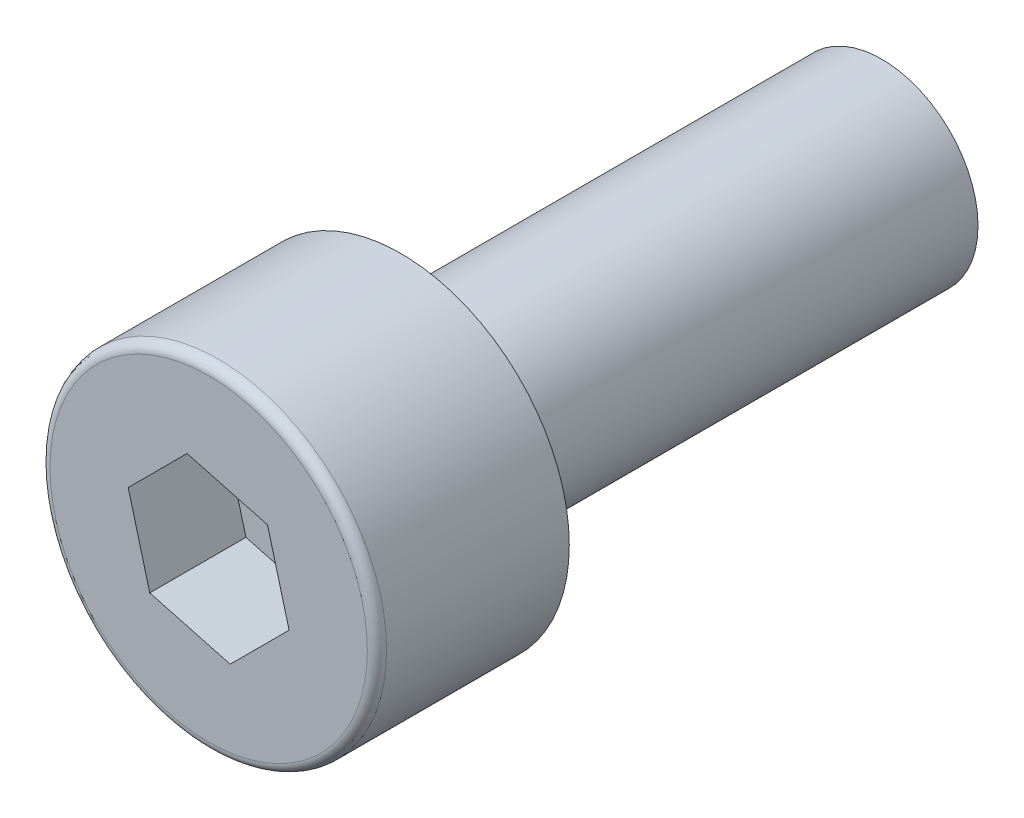
ISO-10303-21;
HEADER;
FILE_DESCRIPTION(('STEP AP214'),'2;1');
FILE_NAME('part.step','',(''),(''),'','','');
FILE_SCHEMA(('AUTOMOTIVE_DESIGN { 1 0 10303 214 1 1 1 1 }'));
ENDSEC;
DATA;
#1=APPLICATION_CONTEXT('core data for automotive mechanical design processes');
#2=APPLICATION_PROTOCOL_DEFINITION('international standard','automotive_design',2000,#1);
#3=PRODUCT_CONTEXT('',#1,'mechanical');
#4=PRODUCT('Part','Part','',(#3));
#5=PRODUCT_RELATED_PRODUCT_CATEGORY('part','',(#4));
#6=PRODUCT_DEFINITION_FORMATION('','',#4);
#7=PRODUCT_DEFINITION_CONTEXT('part definition',#1,'design');
#8=PRODUCT_DEFINITION('design','',#6,#7);
#9=PRODUCT_DEFINITION_SHAPE('','',#8);
#10=(LENGTH_UNIT() NAMED_UNIT(*) SI_UNIT(.MILLI.,.METRE.));
#11=(NAMED_UNIT(*) PLANE_ANGLE_UNIT() SI_UNIT($,.RADIAN.));
#12=(NAMED_UNIT(*) SI_UNIT($,.STERADIAN.) SOLID_ANGLE_UNIT());
#13=UNCERTAINTY_MEASURE_WITH_UNIT(LENGTH_MEASURE(1.E-05),#10,'distance_accuracy_value','');
#14=(GEOMETRIC_REPRESENTATION_CONTEXT(3) GLOBAL_UNCERTAINTY_ASSIGNED_CONTEXT((#13)) GLOBAL_UNIT_ASSIGNED_CONTEXT((#10,
#11,#12)) REPRESENTATION_CONTEXT('',''));
#15=CARTESIAN_POINT('',(0.,0.,0.));
#16=DIRECTION('',(0.,0.,1.));
#17=DIRECTION('',(1.,0.,0.));
#18=AXIS2_PLACEMENT_3D('',#15,#16,#17);
#19=CARTESIAN_POINT('',(0.,0.,0.));
#20=DIRECTION('',(0.,0.,1.));
#21=DIRECTION('',(1.,0.,0.));
#22=AXIS2_PLACEMENT_3D('',#19,#20,#21);
#23=PLANE('',#22);
#24=CARTESIAN_POINT('',(0.,0.,0.));
#25=DIRECTION('',(0.,0.,1.));
#26=DIRECTION('',(1.,0.,0.));
#27=AXIS2_PLACEMENT_3D('',#24,#25,#26);
#28=CIRCLE('',#27,3.5);
#29=CARTESIAN_POINT('',(3.5,0.,0.));
#30=VERTEX_POINT('',#29);
#31=EDGE_CURVE('E137',#30,#30,#28,.T.);
#32=ORIENTED_EDGE('',*,*,#31,.F.);
#33=EDGE_LOOP('',(#32));
#34=FACE_BOUND('',#33,.T.);
#35=CARTESIAN_POINT('',(0.,0.,0.));
#36=DIRECTION('',(0.,0.,1.));
#37=DIRECTION('',(1.,0.,0.));
#38=AXIS2_PLACEMENT_3D('',#35,#36,#37);
#39=CIRCLE('',#38,2.);
#40=CARTESIAN_POINT('',(2.,0.,0.));
#41=VERTEX_POINT('',#40);
#42=EDGE_CURVE('E145',#41,#41,#39,.F.);
#43=ORIENTED_EDGE('',*,*,#42,.F.);
#44=EDGE_LOOP('',(#43));
#45=FACE_BOUND('',#44,.T.);
#46=ADVANCED_FACE('F34',(#34,#45),#23,.F.);
#47=CARTESIAN_POINT('',(0.,0.,4.));
#48=DIRECTION('',(0.,0.,-1.));
#49=DIRECTION('',(-1.,0.,0.));
#50=AXIS2_PLACEMENT_3D('',#47,#48,#49);
#51=CYLINDRICAL_SURFACE('',#50,3.5);
#52=CARTESIAN_POINT('',(0.,0.,3.8));
#53=DIRECTION('',(0.,0.,1.));
#54=DIRECTION('',(1.,0.,0.));
#55=AXIS2_PLACEMENT_3D('',#52,#53,#54);
#56=CIRCLE('',#55,3.5);
#57=CARTESIAN_POINT('',(3.5,0.,3.8));
#58=VERTEX_POINT('',#57);
#59=EDGE_CURVE('E11',#58,#58,#56,.F.);
#60=ORIENTED_EDGE('',*,*,#59,.T.);
#61=EDGE_LOOP('',(#60));
#62=FACE_BOUND('',#61,.T.);
#63=ORIENTED_EDGE('',*,*,#31,.T.);
#64=EDGE_LOOP('',(#63));
#65=FACE_BOUND('',#64,.T.);
#66=ADVANCED_FACE('F164',(#62,#65),#51,.T.);
#67=CARTESIAN_POINT('',(0.,0.,4.));
#68=DIRECTION('',(0.,0.,1.));
#69=DIRECTION('',(1.,0.,0.));
#70=AXIS2_PLACEMENT_3D('',#67,#68,#69);
#71=PLANE('',#70);
#72=CARTESIAN_POINT('',(0.,0.,4.));
#73=DIRECTION('',(0.,0.,1.));
#74=DIRECTION('',(1.,0.,0.));
#75=AXIS2_PLACEMENT_3D('',#72,#73,#74);
#76=CIRCLE('',#75,3.3);
#77=CARTESIAN_POINT('',(3.3,0.,4.));
#78=VERTEX_POINT('',#77);
#79=EDGE_CURVE('E42',#78,#78,#76,.T.);
#80=ORIENTED_EDGE('',*,*,#79,.T.);
#81=EDGE_LOOP('',(#80));
#82=FACE_BOUND('',#81,.T.);
#83=DIRECTION('',(0.258819045102521,-0.965925826289068,0.));
#84=VECTOR('',#83,1.);
#85=CARTESIAN_POINT('',(-1.67303260747562,0.448287736084027,4.));
#86=LINE('',#85,#84);
#87=CARTESIAN_POINT('',(-1.67303260747562,0.448287736084027,4.));
#88=VERTEX_POINT('',#87);
#89=CARTESIAN_POINT('',(-1.22474487139159,-1.22474487139159,4.));
#90=VERTEX_POINT('',#89);
#91=EDGE_CURVE('E49',#88,#90,#86,.T.);
#92=ORIENTED_EDGE('',*,*,#91,.F.);
#93=DIRECTION('',(-0.707106781186547,-0.707106781186548,0.));
#94=VECTOR('',#93,1.);
#95=CARTESIAN_POINT('',(-0.448287736084027,1.67303260747562,4.));
#96=LINE('',#95,#94);
#97=CARTESIAN_POINT('',(-0.448287736084027,1.67303260747562,4.));
#98=VERTEX_POINT('',#97);
#99=EDGE_CURVE('E133',#98,#88,#96,.T.);
#100=ORIENTED_EDGE('',*,*,#99,.F.);
#101=DIRECTION('',(-0.965925826289068,0.258819045102521,0.));
#102=VECTOR('',#101,1.);
#103=CARTESIAN_POINT('',(1.22474487139159,1.22474487139159,4.));
#104=LINE('',#103,#102);
#105=CARTESIAN_POINT('',(1.22474487139159,1.22474487139159,4.));
#106=VERTEX_POINT('',#105);
#107=EDGE_CURVE('E131',#106,#98,#104,.T.);
#108=ORIENTED_EDGE('',*,*,#107,.F.);
#109=DIRECTION('',(-0.258819045102521,0.965925826289068,0.));
#110=VECTOR('',#109,1.);
#111=CARTESIAN_POINT('',(1.67303260747562,-0.448287736084027,4.));
#112=LINE('',#111,#110);
#113=CARTESIAN_POINT('',(1.67303260747562,-0.448287736084027,4.));
#114=VERTEX_POINT('',#113);
#115=EDGE_CURVE('E97',#114,#106,#112,.T.);
#116=ORIENTED_EDGE('',*,*,#115,.F.);
#117=DIRECTION('',(0.707106781186547,0.707106781186548,0.));
#118=VECTOR('',#117,1.);
#119=CARTESIAN_POINT('',(0.448287736084026,-1.67303260747562,4.));
#120=LINE('',#119,#118);
#121=CARTESIAN_POINT('',(0.448287736084026,-1.67303260747562,4.));
#122=VERTEX_POINT('',#121);
#123=EDGE_CURVE('E127',#122,#114,#120,.T.);
#124=ORIENTED_EDGE('',*,*,#123,.F.);
#125=DIRECTION('',(0.965925826289068,-0.258819045102521,0.));
#126=VECTOR('',#125,1.);
#127=CARTESIAN_POINT('',(-1.22474487139159,-1.22474487139159,4.));
#128=LINE('',#127,#126);
#129=EDGE_CURVE('E123',#90,#122,#128,.T.);
#130=ORIENTED_EDGE('',*,*,#129,.F.);
#131=EDGE_LOOP('',(#92,#100,#108,#116,#124,#130));
#132=FACE_BOUND('',#131,.T.);
#133=ADVANCED_FACE('F150',(#82,#132),#71,.T.);
#134=CARTESIAN_POINT('',(-1.67303260747562,0.448287736084027,2.));
#135=DIRECTION('',(-0.965925826289068,-0.258819045102521,0.));
#136=DIRECTION('',(0.258819045102521,-0.965925826289068,0.));
#137=AXIS2_PLACEMENT_3D('',#134,#135,#136);
#138=PLANE('',#137);
#139=ORIENTED_EDGE('',*,*,#91,.T.);
#140=DIRECTION('',(0.,0.,1.));
#141=VECTOR('',#140,1.);
#142=CARTESIAN_POINT('',(-1.22474487139159,-1.22474487139159,2.));
#143=LINE('',#142,#141);
#144=CARTESIAN_POINT('',(-1.22474487139159,-1.22474487139159,2.));
#145=VERTEX_POINT('',#144);
#146=EDGE_CURVE('E79',#145,#90,#143,.T.);
#147=ORIENTED_EDGE('',*,*,#146,.F.);
#148=DIRECTION('',(0.258819045102521,-0.965925826289068,0.));
#149=VECTOR('',#148,1.);
#150=CARTESIAN_POINT('',(-1.67303260747562,0.448287736084027,2.));
#151=LINE('',#150,#149);
#152=CARTESIAN_POINT('',(-1.67303260747562,0.448287736084027,2.));
#153=VERTEX_POINT('',#152);
#154=EDGE_CURVE('E135',#153,#145,#151,.T.);
#155=ORIENTED_EDGE('',*,*,#154,.F.);
#156=DIRECTION('',(0.,0.,1.));
#157=VECTOR('',#156,1.);
#158=CARTESIAN_POINT('',(-1.67303260747562,0.448287736084027,2.));
#159=LINE('',#158,#157);
#160=EDGE_CURVE('E57',#153,#88,#159,.T.);
#161=ORIENTED_EDGE('',*,*,#160,.T.);
#162=EDGE_LOOP('',(#139,#147,#155,#161));
#163=FACE_BOUND('',#162,.T.);
#164=ADVANCED_FACE('F176',(#163),#138,.F.);
#165=CARTESIAN_POINT('',(-0.448287736084027,1.67303260747562,2.));
#166=DIRECTION('',(-0.707106781186548,0.707106781186547,0.));
#167=DIRECTION('',(-0.707106781186547,-0.707106781186548,0.));
#168=AXIS2_PLACEMENT_3D('',#165,#166,#167);
#169=PLANE('',#168);
#170=ORIENTED_EDGE('',*,*,#99,.T.);
#171=ORIENTED_EDGE('',*,*,#160,.F.);
#172=DIRECTION('',(-0.707106781186547,-0.707106781186548,0.));
#173=VECTOR('',#172,1.);
#174=CARTESIAN_POINT('',(-0.448287736084027,1.67303260747562,2.));
#175=LINE('',#174,#173);
#176=CARTESIAN_POINT('',(-0.448287736084027,1.67303260747562,2.));
#177=VERTEX_POINT('',#176);
#178=EDGE_CURVE('E109',#177,#153,#175,.T.);
#179=ORIENTED_EDGE('',*,*,#178,.F.);
#180=DIRECTION('',(0.,0.,1.));
#181=VECTOR('',#180,1.);
#182=CARTESIAN_POINT('',(-0.448287736084027,1.67303260747562,2.));
#183=LINE('',#182,#181);
#184=EDGE_CURVE('E101',#177,#98,#183,.T.);
#185=ORIENTED_EDGE('',*,*,#184,.T.);
#186=EDGE_LOOP('',(#170,#171,#179,#185));
#187=FACE_BOUND('',#186,.T.);
#188=ADVANCED_FACE('F179',(#187),#169,.F.);
#189=CARTESIAN_POINT('',(1.22474487139159,1.22474487139159,2.));
#190=DIRECTION('',(0.258819045102521,0.965925826289068,0.));
#191=DIRECTION('',(-0.965925826289068,0.258819045102521,0.));
#192=AXIS2_PLACEMENT_3D('',#189,#190,#191);
#193=PLANE('',#192);
#194=ORIENTED_EDGE('',*,*,#107,.T.);
#195=ORIENTED_EDGE('',*,*,#184,.F.);
#196=DIRECTION('',(-0.965925826289068,0.258819045102521,0.));
#197=VECTOR('',#196,1.);
#198=CARTESIAN_POINT('',(1.22474487139159,1.22474487139159,2.));
#199=LINE('',#198,#197);
#200=CARTESIAN_POINT('',(1.22474487139159,1.22474487139159,2.));
#201=VERTEX_POINT('',#200);
#202=EDGE_CURVE('E105',#201,#177,#199,.T.);
#203=ORIENTED_EDGE('',*,*,#202,.F.);
#204=DIRECTION('',(0.,0.,1.));
#205=VECTOR('',#204,1.);
#206=CARTESIAN_POINT('',(1.22474487139159,1.22474487139159,2.));
#207=LINE('',#206,#205);
#208=EDGE_CURVE('E90',#201,#106,#207,.T.);
#209=ORIENTED_EDGE('',*,*,#208,.T.);
#210=EDGE_LOOP('',(#194,#195,#203,#209));
#211=FACE_BOUND('',#210,.T.);
#212=ADVANCED_FACE('F106',(#211),#193,.F.);
#213=CARTESIAN_POINT('',(1.67303260747562,-0.448287736084027,2.));
#214=DIRECTION('',(0.965925826289068,0.258819045102521,0.));
#215=DIRECTION('',(-0.258819045102521,0.965925826289068,0.));
#216=AXIS2_PLACEMENT_3D('',#213,#214,#215);
#217=PLANE('',#216);
#218=ORIENTED_EDGE('',*,*,#115,.T.);
#219=ORIENTED_EDGE('',*,*,#208,.F.);
#220=DIRECTION('',(-0.258819045102521,0.965925826289068,0.));
#221=VECTOR('',#220,1.);
#222=CARTESIAN_POINT('',(1.67303260747562,-0.448287736084027,2.));
#223=LINE('',#222,#221);
#224=CARTESIAN_POINT('',(1.67303260747562,-0.448287736084027,2.));
#225=VERTEX_POINT('',#224);
#226=EDGE_CURVE('E94',#225,#201,#223,.T.);
#227=ORIENTED_EDGE('',*,*,#226,.F.);
#228=DIRECTION('',(0.,0.,1.));
#229=VECTOR('',#228,1.);
#230=CARTESIAN_POINT('',(1.67303260747562,-0.448287736084027,2.));
#231=LINE('',#230,#229);
#232=EDGE_CURVE('E102',#225,#114,#231,.T.);
#233=ORIENTED_EDGE('',*,*,#232,.T.);
#234=EDGE_LOOP('',(#218,#219,#227,#233));
#235=FACE_BOUND('',#234,.T.);
#236=ADVANCED_FACE('F92',(#235),#217,.F.);
#237=CARTESIAN_POINT('',(0.448287736084026,-1.67303260747562,2.));
#238=DIRECTION('',(0.707106781186548,-0.707106781186547,0.));
#239=DIRECTION('',(0.707106781186547,0.707106781186548,0.));
#240=AXIS2_PLACEMENT_3D('',#237,#238,#239);
#241=PLANE('',#240);
#242=ORIENTED_EDGE('',*,*,#123,.T.);
#243=ORIENTED_EDGE('',*,*,#232,.F.);
#244=DIRECTION('',(0.707106781186547,0.707106781186548,0.));
#245=VECTOR('',#244,1.);
#246=CARTESIAN_POINT('',(0.448287736084026,-1.67303260747562,2.));
#247=LINE('',#246,#245);
#248=CARTESIAN_POINT('',(0.448287736084026,-1.67303260747562,2.));
#249=VERTEX_POINT('',#248);
#250=EDGE_CURVE('E115',#249,#225,#247,.T.);
#251=ORIENTED_EDGE('',*,*,#250,.F.);
#252=DIRECTION('',(0.,0.,1.));
#253=VECTOR('',#252,1.);
#254=CARTESIAN_POINT('',(0.448287736084026,-1.67303260747562,2.));
#255=LINE('',#254,#253);
#256=EDGE_CURVE('E140',#249,#122,#255,.T.);
#257=ORIENTED_EDGE('',*,*,#256,.T.);
#258=EDGE_LOOP('',(#242,#243,#251,#257));
#259=FACE_BOUND('',#258,.T.);
#260=ADVANCED_FACE('F183',(#259),#241,.F.);
#261=CARTESIAN_POINT('',(-1.22474487139159,-1.22474487139159,2.));
#262=DIRECTION('',(-0.258819045102521,-0.965925826289068,0.));
#263=DIRECTION('',(0.965925826289068,-0.258819045102521,0.));
#264=AXIS2_PLACEMENT_3D('',#261,#262,#263);
#265=PLANE('',#264);
#266=ORIENTED_EDGE('',*,*,#129,.T.);
#267=ORIENTED_EDGE('',*,*,#256,.F.);
#268=DIRECTION('',(0.965925826289068,-0.258819045102521,0.));
#269=VECTOR('',#268,1.);
#270=CARTESIAN_POINT('',(-1.22474487139159,-1.22474487139159,2.));
#271=LINE('',#270,#269);
#272=EDGE_CURVE('E117',#145,#249,#271,.T.);
#273=ORIENTED_EDGE('',*,*,#272,.F.);
#274=ORIENTED_EDGE('',*,*,#146,.T.);
#275=EDGE_LOOP('',(#266,#267,#273,#274));
#276=FACE_BOUND('',#275,.T.);
#277=ADVANCED_FACE('F180',(#276),#265,.F.);
#278=CARTESIAN_POINT('',(0.,0.,2.));
#279=DIRECTION('',(0.,0.,1.));
#280=DIRECTION('',(1.,0.,0.));
#281=AXIS2_PLACEMENT_3D('',#278,#279,#280);
#282=PLANE('',#281);
#283=ORIENTED_EDGE('',*,*,#154,.T.);
#284=ORIENTED_EDGE('',*,*,#272,.T.);
#285=ORIENTED_EDGE('',*,*,#250,.T.);
#286=ORIENTED_EDGE('',*,*,#226,.T.);
#287=ORIENTED_EDGE('',*,*,#202,.T.);
#288=ORIENTED_EDGE('',*,*,#178,.T.);
#289=EDGE_LOOP('',(#283,#284,#285,#286,#287,#288));
#290=FACE_BOUND('',#289,.T.);
#291=ADVANCED_FACE('F112',(#290),#282,.T.);
#292=CARTESIAN_POINT('',(0.,0.,-10.));
#293=DIRECTION('',(0.,0.,1.));
#294=DIRECTION('',(1.,0.,0.));
#295=AXIS2_PLACEMENT_3D('',#292,#293,#294);
#296=CYLINDRICAL_SURFACE('',#295,2.);
#297=CARTESIAN_POINT('',(0.,0.,-10.));
#298=DIRECTION('',(0.,0.,-1.));
#299=DIRECTION('',(-1.,0.,0.));
#300=AXIS2_PLACEMENT_3D('',#297,#298,#299);
#301=CIRCLE('',#300,2.);
#302=CARTESIAN_POINT('',(-2.,0.,-10.));
#303=VERTEX_POINT('',#302);
#304=EDGE_CURVE('E124',#303,#303,#301,.T.);
#305=ORIENTED_EDGE('',*,*,#304,.F.);
#306=EDGE_LOOP('',(#305));
#307=FACE_BOUND('',#306,.T.);
#308=ORIENTED_EDGE('',*,*,#42,.T.);
#309=EDGE_LOOP('',(#308));
#310=FACE_BOUND('',#309,.T.);
#311=ADVANCED_FACE('F159',(#307,#310),#296,.T.);
#312=CARTESIAN_POINT('',(0.,0.,-10.));
#313=DIRECTION('',(0.,0.,-1.));
#314=DIRECTION('',(-1.,0.,0.));
#315=AXIS2_PLACEMENT_3D('',#312,#313,#314);
#316=PLANE('',#315);
#317=ORIENTED_EDGE('',*,*,#304,.T.);
#318=EDGE_LOOP('',(#317));
#319=FACE_BOUND('',#318,.T.);
#320=ADVANCED_FACE('F154',(#319),#316,.T.);
#321=CARTESIAN_POINT('',(0.,0.,3.8));
#322=DIRECTION('',(0.,0.,1.));
#323=DIRECTION('',(1.,0.,0.));
#324=AXIS2_PLACEMENT_3D('',#321,#322,#323);
#325=TOROIDAL_SURFACE('',#324,3.3,0.2);
#326=ORIENTED_EDGE('',*,*,#59,.F.);
#327=EDGE_LOOP('',(#326));
#328=FACE_BOUND('',#327,.T.);
#329=ORIENTED_EDGE('',*,*,#79,.F.);
#330=EDGE_LOOP('',(#329));
#331=FACE_BOUND('',#330,.T.);
#332=ADVANCED_FACE('F36',(#328,#331),#325,.T.);
#333=CLOSED_SHELL('',(#46,#66,#133,#164,#188,#212,#236,#260,#277,#291,#311,#320,#332));
#334=MANIFOLD_SOLID_BREP('B2',#333);
#335=ADVANCED_BREP_SHAPE_REPRESENTATION('',(#18,#334),#14);
#336=SHAPE_DEFINITION_REPRESENTATION(#9,#335);
ENDSEC;
END-ISO-10303-21;
